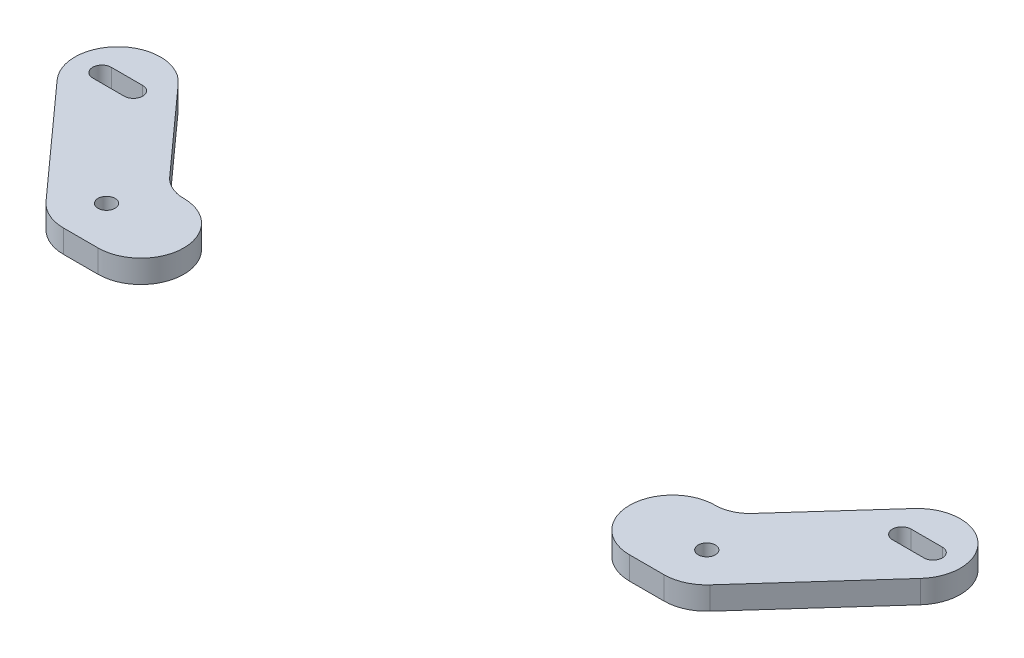
ISO-10303-21;
HEADER;
FILE_DESCRIPTION(('STEP AP214'),'2;1');
FILE_NAME('part.step','',(''),(''),'','','');
FILE_SCHEMA(('AUTOMOTIVE_DESIGN { 1 0 10303 214 1 1 1 1 }'));
ENDSEC;
DATA;
#1=APPLICATION_CONTEXT('core data for automotive mechanical design processes');
#2=APPLICATION_PROTOCOL_DEFINITION('international standard','automotive_design',2000,#1);
#3=PRODUCT_CONTEXT('',#1,'mechanical');
#4=PRODUCT('Part','Part','',(#3));
#5=PRODUCT_RELATED_PRODUCT_CATEGORY('part','',(#4));
#6=PRODUCT_DEFINITION_FORMATION('','',#4);
#7=PRODUCT_DEFINITION_CONTEXT('part definition',#1,'design');
#8=PRODUCT_DEFINITION('design','',#6,#7);
#9=PRODUCT_DEFINITION_SHAPE('','',#8);
#10=(LENGTH_UNIT() NAMED_UNIT(*) SI_UNIT(.MILLI.,.METRE.));
#11=(NAMED_UNIT(*) PLANE_ANGLE_UNIT() SI_UNIT($,.RADIAN.));
#12=(NAMED_UNIT(*) SI_UNIT($,.STERADIAN.) SOLID_ANGLE_UNIT());
#13=UNCERTAINTY_MEASURE_WITH_UNIT(LENGTH_MEASURE(1.E-05),#10,'distance_accuracy_value','');
#14=(GEOMETRIC_REPRESENTATION_CONTEXT(3) GLOBAL_UNCERTAINTY_ASSIGNED_CONTEXT((#13)) GLOBAL_UNIT_ASSIGNED_CONTEXT((#10,
#11,#12)) REPRESENTATION_CONTEXT('',''));
#15=CARTESIAN_POINT('',(0.,0.,0.));
#16=DIRECTION('',(0.,0.,1.));
#17=DIRECTION('',(1.,0.,0.));
#18=AXIS2_PLACEMENT_3D('',#15,#16,#17);
#19=CARTESIAN_POINT('',(92.970606407611,8.,-128.6));
#20=DIRECTION('',(0.,1.,0.));
#21=DIRECTION('',(0.,0.,1.));
#22=AXIS2_PLACEMENT_3D('',#19,#20,#21);
#23=PLANE('',#22);
#24=CARTESIAN_POINT('',(-92.970606407611,8.,-101.6));
#25=DIRECTION('',(0.,-1.,0.));
#26=DIRECTION('',(0.,0.,1.));
#27=AXIS2_PLACEMENT_3D('',#24,#25,#26);
#28=CIRCLE('',#27,15.);
#29=CARTESIAN_POINT('',(-92.970606407611,8.,-116.6));
#30=VERTEX_POINT('',#29);
#31=CARTESIAN_POINT('',(-92.970606407611,8.,-86.6000000000001));
#32=VERTEX_POINT('',#31);
#33=EDGE_CURVE('E12',#30,#32,#28,.T.);
#34=ORIENTED_EDGE('',*,*,#33,.F.);
#35=CARTESIAN_POINT('',(-92.970606407611,8.,-128.6));
#36=DIRECTION('',(0.,-1.,0.));
#37=DIRECTION('',(0.,0.,-1.));
#38=AXIS2_PLACEMENT_3D('',#35,#36,#37);
#39=CIRCLE('',#38,12.);
#40=CARTESIAN_POINT('',(-101.892422533762,8.,-120.574964360756));
#41=VERTEX_POINT('',#40);
#42=EDGE_CURVE('E174',#30,#41,#39,.T.);
#43=ORIENTED_EDGE('',*,*,#42,.T.);
#44=DIRECTION('',(-0.66875296993704,0.,-0.743484677179287));
#45=VECTOR('',#44,1.);
#46=CARTESIAN_POINT('',(-128.747729842311,8.,-150.431294549056));
#47=LINE('',#46,#45);
#48=CARTESIAN_POINT('',(-128.747729842311,8.,-150.431294549056));
#49=VERTEX_POINT('',#48);
#50=EDGE_CURVE('E172',#41,#49,#47,.T.);
#51=ORIENTED_EDGE('',*,*,#50,.T.);
#52=CARTESIAN_POINT('',(-139.9,8.,-140.4));
#53=DIRECTION('',(0.,1.,0.));
#54=DIRECTION('',(0.,0.,1.));
#55=AXIS2_PLACEMENT_3D('',#52,#53,#54);
#56=CIRCLE('',#55,15.);
#57=CARTESIAN_POINT('',(-151.052270157689,8.,-130.368705450944));
#58=VERTEX_POINT('',#57);
#59=EDGE_CURVE('E170',#49,#58,#56,.T.);
#60=ORIENTED_EDGE('',*,*,#59,.T.);
#61=DIRECTION('',(0.668752969937039,0.,0.743484677179287));
#62=VECTOR('',#61,1.);
#63=CARTESIAN_POINT('',(-151.052270157689,8.,-130.368705450944));
#64=LINE('',#63,#62);
#65=CARTESIAN_POINT('',(-116.152270157689,8.,-91.5687054509445));
#66=VERTEX_POINT('',#65);
#67=EDGE_CURVE('E168',#58,#66,#64,.T.);
#68=ORIENTED_EDGE('',*,*,#67,.T.);
#69=CARTESIAN_POINT('',(-105.,8.,-101.6));
#70=DIRECTION('',(0.,1.,0.));
#71=DIRECTION('',(0.,0.,1.));
#72=AXIS2_PLACEMENT_3D('',#69,#70,#71);
#73=CIRCLE('',#72,15.);
#74=CARTESIAN_POINT('',(-105.,8.,-86.6000000000001));
#75=VERTEX_POINT('',#74);
#76=EDGE_CURVE('E165',#66,#75,#73,.T.);
#77=ORIENTED_EDGE('',*,*,#76,.T.);
#78=DIRECTION('',(1.,0.,0.));
#79=VECTOR('',#78,1.);
#80=CARTESIAN_POINT('',(105.,8.,-86.6000000000001));
#81=LINE('',#80,#79);
#82=EDGE_CURVE('E167',#75,#32,#81,.T.);
#83=ORIENTED_EDGE('',*,*,#82,.T.);
#84=EDGE_LOOP('',(#34,#43,#51,#60,#68,#77,#83));
#85=FACE_BOUND('',#84,.T.);
#86=DIRECTION('',(1.,0.,0.));
#87=VECTOR('',#86,1.);
#88=CARTESIAN_POINT('',(-145.4,8.,-137.15));
#89=LINE('',#88,#87);
#90=CARTESIAN_POINT('',(-145.4,8.,-137.15));
#91=VERTEX_POINT('',#90);
#92=CARTESIAN_POINT('',(-134.4,8.,-137.15));
#93=VERTEX_POINT('',#92);
#94=EDGE_CURVE('E179',#91,#93,#89,.T.);
#95=ORIENTED_EDGE('',*,*,#94,.F.);
#96=CARTESIAN_POINT('',(-145.4,8.,-140.4));
#97=DIRECTION('',(0.,1.,0.));
#98=DIRECTION('',(0.,0.,1.));
#99=AXIS2_PLACEMENT_3D('',#96,#97,#98);
#100=CIRCLE('',#99,3.25);
#101=CARTESIAN_POINT('',(-145.4,8.,-143.65));
#102=VERTEX_POINT('',#101);
#103=EDGE_CURVE('E180',#102,#91,#100,.T.);
#104=ORIENTED_EDGE('',*,*,#103,.F.);
#105=DIRECTION('',(-1.,0.,0.));
#106=VECTOR('',#105,1.);
#107=CARTESIAN_POINT('',(-145.4,8.,-143.65));
#108=LINE('',#107,#106);
#109=CARTESIAN_POINT('',(-134.4,8.,-143.65));
#110=VERTEX_POINT('',#109);
#111=EDGE_CURVE('E186',#110,#102,#108,.T.);
#112=ORIENTED_EDGE('',*,*,#111,.F.);
#113=CARTESIAN_POINT('',(-134.4,8.,-140.4));
#114=DIRECTION('',(0.,1.,0.));
#115=DIRECTION('',(0.,0.,1.));
#116=AXIS2_PLACEMENT_3D('',#113,#114,#115);
#117=CIRCLE('',#116,3.25);
#118=EDGE_CURVE('E183',#93,#110,#117,.T.);
#119=ORIENTED_EDGE('',*,*,#118,.F.);
#120=EDGE_LOOP('',(#95,#104,#112,#119));
#121=FACE_BOUND('',#120,.T.);
#122=CARTESIAN_POINT('',(-105.,8.,-101.6));
#123=DIRECTION('',(0.,1.,0.));
#124=DIRECTION('',(0.,0.,1.));
#125=AXIS2_PLACEMENT_3D('',#122,#123,#124);
#126=CIRCLE('',#125,2.99999999999999);
#127=CARTESIAN_POINT('',(-105.,8.,-98.6000000000001));
#128=VERTEX_POINT('',#127);
#129=EDGE_CURVE('E58',#128,#128,#126,.T.);
#130=ORIENTED_EDGE('',*,*,#129,.F.);
#131=EDGE_LOOP('',(#130));
#132=FACE_BOUND('',#131,.T.);
#133=ADVANCED_FACE('F49',(#85,#121,#132),#23,.T.);
#134=CARTESIAN_POINT('',(92.970606407611,0.,-128.6));
#135=DIRECTION('',(0.,1.,0.));
#136=DIRECTION('',(0.,0.,1.));
#137=AXIS2_PLACEMENT_3D('',#134,#135,#136);
#138=PLANE('',#137);
#139=CARTESIAN_POINT('',(-105.,0.,-101.6));
#140=DIRECTION('',(0.,1.,0.));
#141=DIRECTION('',(0.,0.,1.));
#142=AXIS2_PLACEMENT_3D('',#139,#140,#141);
#143=CIRCLE('',#142,2.99999999999999);
#144=CARTESIAN_POINT('',(-105.,0.,-98.6000000000001));
#145=VERTEX_POINT('',#144);
#146=EDGE_CURVE('E201',#145,#145,#143,.T.);
#147=ORIENTED_EDGE('',*,*,#146,.T.);
#148=EDGE_LOOP('',(#147));
#149=FACE_BOUND('',#148,.T.);
#150=CARTESIAN_POINT('',(-145.4,0.,-140.4));
#151=DIRECTION('',(0.,1.,0.));
#152=DIRECTION('',(0.,0.,1.));
#153=AXIS2_PLACEMENT_3D('',#150,#151,#152);
#154=CIRCLE('',#153,3.25);
#155=CARTESIAN_POINT('',(-145.4,0.,-143.65));
#156=VERTEX_POINT('',#155);
#157=CARTESIAN_POINT('',(-145.4,0.,-137.15));
#158=VERTEX_POINT('',#157);
#159=EDGE_CURVE('E198',#156,#158,#154,.T.);
#160=ORIENTED_EDGE('',*,*,#159,.T.);
#161=DIRECTION('',(1.,0.,0.));
#162=VECTOR('',#161,1.);
#163=CARTESIAN_POINT('',(-145.4,0.,-137.15));
#164=LINE('',#163,#162);
#165=CARTESIAN_POINT('',(-134.4,0.,-137.15));
#166=VERTEX_POINT('',#165);
#167=EDGE_CURVE('E195',#158,#166,#164,.T.);
#168=ORIENTED_EDGE('',*,*,#167,.T.);
#169=CARTESIAN_POINT('',(-134.4,0.,-140.4));
#170=DIRECTION('',(0.,1.,0.));
#171=DIRECTION('',(0.,0.,1.));
#172=AXIS2_PLACEMENT_3D('',#169,#170,#171);
#173=CIRCLE('',#172,3.25);
#174=CARTESIAN_POINT('',(-134.4,0.,-143.65));
#175=VERTEX_POINT('',#174);
#176=EDGE_CURVE('E192',#166,#175,#173,.T.);
#177=ORIENTED_EDGE('',*,*,#176,.T.);
#178=DIRECTION('',(-1.,0.,0.));
#179=VECTOR('',#178,1.);
#180=CARTESIAN_POINT('',(-145.4,0.,-143.65));
#181=LINE('',#180,#179);
#182=EDGE_CURVE('E143',#175,#156,#181,.T.);
#183=ORIENTED_EDGE('',*,*,#182,.T.);
#184=EDGE_LOOP('',(#160,#168,#177,#183));
#185=FACE_BOUND('',#184,.T.);
#186=CARTESIAN_POINT('',(-92.970606407611,0.,-128.6));
#187=DIRECTION('',(0.,-1.,0.));
#188=DIRECTION('',(0.,0.,-1.));
#189=AXIS2_PLACEMENT_3D('',#186,#187,#188);
#190=CIRCLE('',#189,12.);
#191=CARTESIAN_POINT('',(-92.970606407611,0.,-116.6));
#192=VERTEX_POINT('',#191);
#193=CARTESIAN_POINT('',(-101.892422533762,0.,-120.574964360756));
#194=VERTEX_POINT('',#193);
#195=EDGE_CURVE('E142',#192,#194,#190,.T.);
#196=ORIENTED_EDGE('',*,*,#195,.F.);
#197=CARTESIAN_POINT('',(-92.970606407611,0.,-101.6));
#198=DIRECTION('',(0.,-1.,0.));
#199=DIRECTION('',(0.,0.,1.));
#200=AXIS2_PLACEMENT_3D('',#197,#198,#199);
#201=CIRCLE('',#200,15.);
#202=CARTESIAN_POINT('',(-92.970606407611,0.,-86.6000000000001));
#203=VERTEX_POINT('',#202);
#204=EDGE_CURVE('E129',#192,#203,#201,.T.);
#205=ORIENTED_EDGE('',*,*,#204,.T.);
#206=DIRECTION('',(1.,0.,0.));
#207=VECTOR('',#206,1.);
#208=CARTESIAN_POINT('',(105.,0.,-86.6000000000001));
#209=LINE('',#208,#207);
#210=CARTESIAN_POINT('',(-105.,0.,-86.6000000000001));
#211=VERTEX_POINT('',#210);
#212=EDGE_CURVE('E52',#211,#203,#209,.T.);
#213=ORIENTED_EDGE('',*,*,#212,.F.);
#214=CARTESIAN_POINT('',(-105.,0.,-101.6));
#215=DIRECTION('',(0.,1.,0.));
#216=DIRECTION('',(0.,0.,1.));
#217=AXIS2_PLACEMENT_3D('',#214,#215,#216);
#218=CIRCLE('',#217,15.);
#219=CARTESIAN_POINT('',(-116.152270157689,0.,-91.5687054509445));
#220=VERTEX_POINT('',#219);
#221=EDGE_CURVE('E154',#220,#211,#218,.T.);
#222=ORIENTED_EDGE('',*,*,#221,.F.);
#223=DIRECTION('',(0.668752969937039,0.,0.743484677179287));
#224=VECTOR('',#223,1.);
#225=CARTESIAN_POINT('',(-151.052270157689,0.,-130.368705450944));
#226=LINE('',#225,#224);
#227=CARTESIAN_POINT('',(-151.052270157689,0.,-130.368705450944));
#228=VERTEX_POINT('',#227);
#229=EDGE_CURVE('E157',#228,#220,#226,.T.);
#230=ORIENTED_EDGE('',*,*,#229,.F.);
#231=CARTESIAN_POINT('',(-139.9,0.,-140.4));
#232=DIRECTION('',(0.,1.,0.));
#233=DIRECTION('',(0.,0.,1.));
#234=AXIS2_PLACEMENT_3D('',#231,#232,#233);
#235=CIRCLE('',#234,15.);
#236=CARTESIAN_POINT('',(-128.747729842311,0.,-150.431294549056));
#237=VERTEX_POINT('',#236);
#238=EDGE_CURVE('E160',#237,#228,#235,.T.);
#239=ORIENTED_EDGE('',*,*,#238,.F.);
#240=DIRECTION('',(-0.66875296993704,0.,-0.743484677179287));
#241=VECTOR('',#240,1.);
#242=CARTESIAN_POINT('',(-128.747729842311,0.,-150.431294549056));
#243=LINE('',#242,#241);
#244=EDGE_CURVE('E163',#194,#237,#243,.T.);
#245=ORIENTED_EDGE('',*,*,#244,.F.);
#246=EDGE_LOOP('',(#196,#205,#213,#222,#230,#239,#245));
#247=FACE_BOUND('',#246,.T.);
#248=ADVANCED_FACE('F139',(#149,#185,#247),#138,.F.);
#249=CARTESIAN_POINT('',(105.,8.,-86.6000000000001));
#250=DIRECTION('',(0.,0.,-1.));
#251=DIRECTION('',(-1.,0.,0.));
#252=AXIS2_PLACEMENT_3D('',#249,#250,#251);
#253=PLANE('',#252);
#254=DIRECTION('',(0.,1.,0.));
#255=VECTOR('',#254,1.);
#256=CARTESIAN_POINT('',(-92.970606407611,0.,-86.6000000000001));
#257=LINE('',#256,#255);
#258=EDGE_CURVE('E126',#203,#32,#257,.T.);
#259=ORIENTED_EDGE('',*,*,#258,.T.);
#260=ORIENTED_EDGE('',*,*,#82,.F.);
#261=DIRECTION('',(0.,-1.,0.));
#262=VECTOR('',#261,1.);
#263=CARTESIAN_POINT('',(-105.,8.,-86.6000000000001));
#264=LINE('',#263,#262);
#265=EDGE_CURVE('E134',#75,#211,#264,.T.);
#266=ORIENTED_EDGE('',*,*,#265,.T.);
#267=ORIENTED_EDGE('',*,*,#212,.T.);
#268=EDGE_LOOP('',(#259,#260,#266,#267));
#269=FACE_BOUND('',#268,.T.);
#270=ADVANCED_FACE('F146',(#269),#253,.F.);
#271=CARTESIAN_POINT('',(-92.970606407611,8.,-128.6));
#272=DIRECTION('',(0.,-1.,0.));
#273=DIRECTION('',(0.,0.,-1.));
#274=AXIS2_PLACEMENT_3D('',#271,#272,#273);
#275=CYLINDRICAL_SURFACE('',#274,12.);
#276=ORIENTED_EDGE('',*,*,#195,.T.);
#277=DIRECTION('',(0.,-1.,0.));
#278=VECTOR('',#277,1.);
#279=CARTESIAN_POINT('',(-101.892422533762,8.,-120.574964360756));
#280=LINE('',#279,#278);
#281=EDGE_CURVE('E162',#41,#194,#280,.T.);
#282=ORIENTED_EDGE('',*,*,#281,.F.);
#283=ORIENTED_EDGE('',*,*,#42,.F.);
#284=DIRECTION('',(0.,-1.,0.));
#285=VECTOR('',#284,1.);
#286=CARTESIAN_POINT('',(-92.970606407611,8.,-116.6));
#287=LINE('',#286,#285);
#288=EDGE_CURVE('E66',#30,#192,#287,.T.);
#289=ORIENTED_EDGE('',*,*,#288,.T.);
#290=EDGE_LOOP('',(#276,#282,#283,#289));
#291=FACE_BOUND('',#290,.T.);
#292=ADVANCED_FACE('F233',(#291),#275,.F.);
#293=CARTESIAN_POINT('',(-128.747729842311,8.,-150.431294549056));
#294=DIRECTION('',(-0.743484677179287,0.,0.66875296993704));
#295=DIRECTION('',(0.66875296993704,0.,0.743484677179287));
#296=AXIS2_PLACEMENT_3D('',#293,#294,#295);
#297=PLANE('',#296);
#298=ORIENTED_EDGE('',*,*,#244,.T.);
#299=DIRECTION('',(0.,-1.,0.));
#300=VECTOR('',#299,1.);
#301=CARTESIAN_POINT('',(-128.747729842311,8.,-150.431294549056));
#302=LINE('',#301,#300);
#303=EDGE_CURVE('E159',#49,#237,#302,.T.);
#304=ORIENTED_EDGE('',*,*,#303,.F.);
#305=ORIENTED_EDGE('',*,*,#50,.F.);
#306=ORIENTED_EDGE('',*,*,#281,.T.);
#307=EDGE_LOOP('',(#298,#304,#305,#306));
#308=FACE_BOUND('',#307,.T.);
#309=ADVANCED_FACE('F238',(#308),#297,.F.);
#310=CARTESIAN_POINT('',(-139.9,8.,-140.4));
#311=DIRECTION('',(0.,-1.,0.));
#312=DIRECTION('',(0.,0.,-1.));
#313=AXIS2_PLACEMENT_3D('',#310,#311,#312);
#314=CYLINDRICAL_SURFACE('',#313,15.);
#315=ORIENTED_EDGE('',*,*,#238,.T.);
#316=DIRECTION('',(0.,-1.,0.));
#317=VECTOR('',#316,1.);
#318=CARTESIAN_POINT('',(-151.052270157689,8.,-130.368705450944));
#319=LINE('',#318,#317);
#320=EDGE_CURVE('E156',#58,#228,#319,.T.);
#321=ORIENTED_EDGE('',*,*,#320,.F.);
#322=ORIENTED_EDGE('',*,*,#59,.F.);
#323=ORIENTED_EDGE('',*,*,#303,.T.);
#324=EDGE_LOOP('',(#315,#321,#322,#323));
#325=FACE_BOUND('',#324,.T.);
#326=ADVANCED_FACE('F239',(#325),#314,.T.);
#327=CARTESIAN_POINT('',(-151.052270157689,8.,-130.368705450944));
#328=DIRECTION('',(0.743484677179287,0.,-0.668752969937039));
#329=DIRECTION('',(-0.668752969937039,0.,-0.743484677179287));
#330=AXIS2_PLACEMENT_3D('',#327,#328,#329);
#331=PLANE('',#330);
#332=ORIENTED_EDGE('',*,*,#229,.T.);
#333=DIRECTION('',(0.,-1.,0.));
#334=VECTOR('',#333,1.);
#335=CARTESIAN_POINT('',(-116.152270157689,8.,-91.5687054509445));
#336=LINE('',#335,#334);
#337=EDGE_CURVE('E152',#66,#220,#336,.T.);
#338=ORIENTED_EDGE('',*,*,#337,.F.);
#339=ORIENTED_EDGE('',*,*,#67,.F.);
#340=ORIENTED_EDGE('',*,*,#320,.T.);
#341=EDGE_LOOP('',(#332,#338,#339,#340));
#342=FACE_BOUND('',#341,.T.);
#343=ADVANCED_FACE('F223',(#342),#331,.F.);
#344=CARTESIAN_POINT('',(-105.,8.,-101.6));
#345=DIRECTION('',(0.,-1.,0.));
#346=DIRECTION('',(0.,0.,-1.));
#347=AXIS2_PLACEMENT_3D('',#344,#345,#346);
#348=CYLINDRICAL_SURFACE('',#347,15.);
#349=ORIENTED_EDGE('',*,*,#221,.T.);
#350=ORIENTED_EDGE('',*,*,#265,.F.);
#351=ORIENTED_EDGE('',*,*,#76,.F.);
#352=ORIENTED_EDGE('',*,*,#337,.T.);
#353=EDGE_LOOP('',(#349,#350,#351,#352));
#354=FACE_BOUND('',#353,.T.);
#355=ADVANCED_FACE('F218',(#354),#348,.T.);
#356=CARTESIAN_POINT('',(-145.4,8.,-140.4));
#357=DIRECTION('',(0.,-1.,0.));
#358=DIRECTION('',(0.,0.,-1.));
#359=AXIS2_PLACEMENT_3D('',#356,#357,#358);
#360=CYLINDRICAL_SURFACE('',#359,3.25);
#361=ORIENTED_EDGE('',*,*,#159,.F.);
#362=DIRECTION('',(0.,-1.,0.));
#363=VECTOR('',#362,1.);
#364=CARTESIAN_POINT('',(-145.4,8.,-143.65));
#365=LINE('',#364,#363);
#366=EDGE_CURVE('E187',#102,#156,#365,.T.);
#367=ORIENTED_EDGE('',*,*,#366,.F.);
#368=ORIENTED_EDGE('',*,*,#103,.T.);
#369=DIRECTION('',(0.,-1.,0.));
#370=VECTOR('',#369,1.);
#371=CARTESIAN_POINT('',(-145.4,8.,-137.15));
#372=LINE('',#371,#370);
#373=EDGE_CURVE('E176',#91,#158,#372,.T.);
#374=ORIENTED_EDGE('',*,*,#373,.T.);
#375=EDGE_LOOP('',(#361,#367,#368,#374));
#376=FACE_BOUND('',#375,.T.);
#377=ADVANCED_FACE('F276',(#376),#360,.F.);
#378=CARTESIAN_POINT('',(-145.4,8.,-137.15));
#379=DIRECTION('',(0.,0.,-1.));
#380=DIRECTION('',(-1.,0.,0.));
#381=AXIS2_PLACEMENT_3D('',#378,#379,#380);
#382=PLANE('',#381);
#383=ORIENTED_EDGE('',*,*,#167,.F.);
#384=ORIENTED_EDGE('',*,*,#373,.F.);
#385=ORIENTED_EDGE('',*,*,#94,.T.);
#386=DIRECTION('',(0.,-1.,0.));
#387=VECTOR('',#386,1.);
#388=CARTESIAN_POINT('',(-134.4,8.,-137.15));
#389=LINE('',#388,#387);
#390=EDGE_CURVE('E181',#93,#166,#389,.T.);
#391=ORIENTED_EDGE('',*,*,#390,.T.);
#392=EDGE_LOOP('',(#383,#384,#385,#391));
#393=FACE_BOUND('',#392,.T.);
#394=ADVANCED_FACE('F272',(#393),#382,.T.);
#395=CARTESIAN_POINT('',(-134.4,8.,-140.4));
#396=DIRECTION('',(0.,-1.,0.));
#397=DIRECTION('',(0.,0.,-1.));
#398=AXIS2_PLACEMENT_3D('',#395,#396,#397);
#399=CYLINDRICAL_SURFACE('',#398,3.25);
#400=ORIENTED_EDGE('',*,*,#176,.F.);
#401=ORIENTED_EDGE('',*,*,#390,.F.);
#402=ORIENTED_EDGE('',*,*,#118,.T.);
#403=DIRECTION('',(0.,-1.,0.));
#404=VECTOR('',#403,1.);
#405=CARTESIAN_POINT('',(-134.4,8.,-143.65));
#406=LINE('',#405,#404);
#407=EDGE_CURVE('E184',#110,#175,#406,.T.);
#408=ORIENTED_EDGE('',*,*,#407,.T.);
#409=EDGE_LOOP('',(#400,#401,#402,#408));
#410=FACE_BOUND('',#409,.T.);
#411=ADVANCED_FACE('F268',(#410),#399,.F.);
#412=CARTESIAN_POINT('',(-145.4,8.,-143.65));
#413=DIRECTION('',(0.,0.,1.));
#414=DIRECTION('',(1.,0.,0.));
#415=AXIS2_PLACEMENT_3D('',#412,#413,#414);
#416=PLANE('',#415);
#417=ORIENTED_EDGE('',*,*,#182,.F.);
#418=ORIENTED_EDGE('',*,*,#407,.F.);
#419=ORIENTED_EDGE('',*,*,#111,.T.);
#420=ORIENTED_EDGE('',*,*,#366,.T.);
#421=EDGE_LOOP('',(#417,#418,#419,#420));
#422=FACE_BOUND('',#421,.T.);
#423=ADVANCED_FACE('F264',(#422),#416,.T.);
#424=CARTESIAN_POINT('',(-105.,8.,-101.6));
#425=DIRECTION('',(0.,-1.,0.));
#426=DIRECTION('',(0.,0.,-1.));
#427=AXIS2_PLACEMENT_3D('',#424,#425,#426);
#428=CYLINDRICAL_SURFACE('',#427,2.99999999999999);
#429=ORIENTED_EDGE('',*,*,#129,.T.);
#430=EDGE_LOOP('',(#429));
#431=FACE_BOUND('',#430,.T.);
#432=ORIENTED_EDGE('',*,*,#146,.F.);
#433=EDGE_LOOP('',(#432));
#434=FACE_BOUND('',#433,.T.);
#435=ADVANCED_FACE('F261',(#431,#434),#428,.F.);
#436=CARTESIAN_POINT('',(-92.970606407611,0.,-101.6));
#437=DIRECTION('',(0.,1.,0.));
#438=DIRECTION('',(0.,0.,1.));
#439=AXIS2_PLACEMENT_3D('',#436,#437,#438);
#440=CYLINDRICAL_SURFACE('',#439,15.);
#441=ORIENTED_EDGE('',*,*,#33,.T.);
#442=ORIENTED_EDGE('',*,*,#258,.F.);
#443=ORIENTED_EDGE('',*,*,#204,.F.);
#444=ORIENTED_EDGE('',*,*,#288,.F.);
#445=EDGE_LOOP('',(#441,#442,#443,#444));
#446=FACE_BOUND('',#445,.T.);
#447=ADVANCED_FACE('F128',(#446),#440,.T.);
#448=CLOSED_SHELL('',(#133,#248,#270,#292,#309,#326,#343,#355,#377,#394,#411,#423,#435,#447));
#449=MANIFOLD_SOLID_BREP('B2',#448);
#450=CARTESIAN_POINT('',(105.,8.,-101.6));
#451=DIRECTION('',(0.,-1.,0.));
#452=DIRECTION('',(0.,0.,-1.));
#453=AXIS2_PLACEMENT_3D('',#450,#451,#452);
#454=CYLINDRICAL_SURFACE('',#453,2.99999999999996);
#455=CARTESIAN_POINT('',(105.,8.,-101.6));
#456=DIRECTION('',(0.,1.,0.));
#457=DIRECTION('',(0.,0.,1.));
#458=AXIS2_PLACEMENT_3D('',#455,#456,#457);
#459=CIRCLE('',#458,2.99999999999996);
#460=CARTESIAN_POINT('',(105.,8.,-98.6000000000001));
#461=VERTEX_POINT('',#460);
#462=EDGE_CURVE('E527',#461,#461,#459,.T.);
#463=ORIENTED_EDGE('',*,*,#462,.T.);
#464=EDGE_LOOP('',(#463));
#465=FACE_BOUND('',#464,.T.);
#466=CARTESIAN_POINT('',(105.,0.,-101.6));
#467=DIRECTION('',(0.,1.,0.));
#468=DIRECTION('',(0.,0.,1.));
#469=AXIS2_PLACEMENT_3D('',#466,#467,#468);
#470=CIRCLE('',#469,2.99999999999996);
#471=CARTESIAN_POINT('',(105.,0.,-98.6000000000001));
#472=VERTEX_POINT('',#471);
#473=EDGE_CURVE('E534',#472,#472,#470,.T.);
#474=ORIENTED_EDGE('',*,*,#473,.F.);
#475=EDGE_LOOP('',(#474));
#476=FACE_BOUND('',#475,.T.);
#477=ADVANCED_FACE('F350',(#465,#476),#454,.F.);
#478=CARTESIAN_POINT('',(145.4,8.,-137.15));
#479=DIRECTION('',(0.,0.,-1.));
#480=DIRECTION('',(-1.,0.,0.));
#481=AXIS2_PLACEMENT_3D('',#478,#479,#480);
#482=PLANE('',#481);
#483=DIRECTION('',(1.,0.,0.));
#484=VECTOR('',#483,1.);
#485=CARTESIAN_POINT('',(145.4,0.,-137.15));
#486=LINE('',#485,#484);
#487=CARTESIAN_POINT('',(134.4,0.,-137.15));
#488=VERTEX_POINT('',#487);
#489=CARTESIAN_POINT('',(145.4,0.,-137.15));
#490=VERTEX_POINT('',#489);
#491=EDGE_CURVE('E514',#488,#490,#486,.T.);
#492=ORIENTED_EDGE('',*,*,#491,.F.);
#493=DIRECTION('',(0.,-1.,0.));
#494=VECTOR('',#493,1.);
#495=CARTESIAN_POINT('',(134.4,8.,-137.15));
#496=LINE('',#495,#494);
#497=CARTESIAN_POINT('',(134.4,8.,-137.15));
#498=VERTEX_POINT('',#497);
#499=EDGE_CURVE('E372',#498,#488,#496,.T.);
#500=ORIENTED_EDGE('',*,*,#499,.F.);
#501=DIRECTION('',(1.,0.,0.));
#502=VECTOR('',#501,1.);
#503=CARTESIAN_POINT('',(145.4,8.,-137.15));
#504=LINE('',#503,#502);
#505=CARTESIAN_POINT('',(145.4,8.,-137.15));
#506=VERTEX_POINT('',#505);
#507=EDGE_CURVE('E513',#498,#506,#504,.T.);
#508=ORIENTED_EDGE('',*,*,#507,.T.);
#509=DIRECTION('',(0.,-1.,0.));
#510=VECTOR('',#509,1.);
#511=CARTESIAN_POINT('',(145.4,8.,-137.15));
#512=LINE('',#511,#510);
#513=EDGE_CURVE('E510',#506,#490,#512,.T.);
#514=ORIENTED_EDGE('',*,*,#513,.T.);
#515=EDGE_LOOP('',(#492,#500,#508,#514));
#516=FACE_BOUND('',#515,.T.);
#517=ADVANCED_FACE('F551',(#516),#482,.T.);
#518=CARTESIAN_POINT('',(134.4,8.,-140.4));
#519=DIRECTION('',(0.,-1.,0.));
#520=DIRECTION('',(0.,0.,-1.));
#521=AXIS2_PLACEMENT_3D('',#518,#519,#520);
#522=CYLINDRICAL_SURFACE('',#521,3.25);
#523=CARTESIAN_POINT('',(134.4,0.,-140.4));
#524=DIRECTION('',(0.,1.,0.));
#525=DIRECTION('',(0.,0.,1.));
#526=AXIS2_PLACEMENT_3D('',#523,#524,#525);
#527=CIRCLE('',#526,3.25);
#528=CARTESIAN_POINT('',(134.4,0.,-143.65));
#529=VERTEX_POINT('',#528);
#530=EDGE_CURVE('E518',#529,#488,#527,.T.);
#531=ORIENTED_EDGE('',*,*,#530,.F.);
#532=DIRECTION('',(0.,-1.,0.));
#533=VECTOR('',#532,1.);
#534=CARTESIAN_POINT('',(134.4,8.,-143.65));
#535=LINE('',#534,#533);
#536=CARTESIAN_POINT('',(134.4,8.,-143.65));
#537=VERTEX_POINT('',#536);
#538=EDGE_CURVE('E456',#537,#529,#535,.T.);
#539=ORIENTED_EDGE('',*,*,#538,.F.);
#540=CARTESIAN_POINT('',(134.4,8.,-140.4));
#541=DIRECTION('',(0.,1.,0.));
#542=DIRECTION('',(0.,0.,1.));
#543=AXIS2_PLACEMENT_3D('',#540,#541,#542);
#544=CIRCLE('',#543,3.25);
#545=EDGE_CURVE('E529',#537,#498,#544,.T.);
#546=ORIENTED_EDGE('',*,*,#545,.T.);
#547=ORIENTED_EDGE('',*,*,#499,.T.);
#548=EDGE_LOOP('',(#531,#539,#546,#547));
#549=FACE_BOUND('',#548,.T.);
#550=ADVANCED_FACE('F557',(#549),#522,.F.);
#551=CARTESIAN_POINT('',(145.4,8.,-143.65));
#552=DIRECTION('',(0.,0.,1.));
#553=DIRECTION('',(1.,0.,0.));
#554=AXIS2_PLACEMENT_3D('',#551,#552,#553);
#555=PLANE('',#554);
#556=DIRECTION('',(-1.,0.,0.));
#557=VECTOR('',#556,1.);
#558=CARTESIAN_POINT('',(145.4,0.,-143.65));
#559=LINE('',#558,#557);
#560=CARTESIAN_POINT('',(145.4,0.,-143.65));
#561=VERTEX_POINT('',#560);
#562=EDGE_CURVE('E521',#561,#529,#559,.T.);
#563=ORIENTED_EDGE('',*,*,#562,.F.);
#564=DIRECTION('',(0.,-1.,0.));
#565=VECTOR('',#564,1.);
#566=CARTESIAN_POINT('',(145.4,8.,-143.65));
#567=LINE('',#566,#565);
#568=CARTESIAN_POINT('',(145.4,8.,-143.65));
#569=VERTEX_POINT('',#568);
#570=EDGE_CURVE('E451',#569,#561,#567,.T.);
#571=ORIENTED_EDGE('',*,*,#570,.F.);
#572=DIRECTION('',(-1.,0.,0.));
#573=VECTOR('',#572,1.);
#574=CARTESIAN_POINT('',(145.4,8.,-143.65));
#575=LINE('',#574,#573);
#576=EDGE_CURVE('E531',#569,#537,#575,.T.);
#577=ORIENTED_EDGE('',*,*,#576,.T.);
#578=ORIENTED_EDGE('',*,*,#538,.T.);
#579=EDGE_LOOP('',(#563,#571,#577,#578));
#580=FACE_BOUND('',#579,.T.);
#581=ADVANCED_FACE('F564',(#580),#555,.T.);
#582=CARTESIAN_POINT('',(145.4,8.,-140.4));
#583=DIRECTION('',(0.,-1.,0.));
#584=DIRECTION('',(0.,0.,-1.));
#585=AXIS2_PLACEMENT_3D('',#582,#583,#584);
#586=CYLINDRICAL_SURFACE('',#585,3.25);
#587=CARTESIAN_POINT('',(145.4,0.,-140.4));
#588=DIRECTION('',(0.,1.,0.));
#589=DIRECTION('',(0.,0.,1.));
#590=AXIS2_PLACEMENT_3D('',#587,#588,#589);
#591=CIRCLE('',#590,3.25);
#592=EDGE_CURVE('E524',#490,#561,#591,.T.);
#593=ORIENTED_EDGE('',*,*,#592,.F.);
#594=ORIENTED_EDGE('',*,*,#513,.F.);
#595=CARTESIAN_POINT('',(145.4,8.,-140.4));
#596=DIRECTION('',(0.,1.,0.));
#597=DIRECTION('',(0.,0.,1.));
#598=AXIS2_PLACEMENT_3D('',#595,#596,#597);
#599=CIRCLE('',#598,3.25);
#600=EDGE_CURVE('E517',#506,#569,#599,.T.);
#601=ORIENTED_EDGE('',*,*,#600,.T.);
#602=ORIENTED_EDGE('',*,*,#570,.T.);
#603=EDGE_LOOP('',(#593,#594,#601,#602));
#604=FACE_BOUND('',#603,.T.);
#605=ADVANCED_FACE('F568',(#604),#586,.F.);
#606=CARTESIAN_POINT('',(116.152270157689,8.,-91.5687054509444));
#607=DIRECTION('',(-0.743484677179287,0.,-0.66875296993704));
#608=DIRECTION('',(-0.66875296993704,0.,0.743484677179287));
#609=AXIS2_PLACEMENT_3D('',#606,#607,#608);
#610=PLANE('',#609);
#611=DIRECTION('',(0.66875296993704,0.,-0.743484677179287));
#612=VECTOR('',#611,1.);
#613=CARTESIAN_POINT('',(116.152270157689,0.,-91.5687054509444));
#614=LINE('',#613,#612);
#615=CARTESIAN_POINT('',(116.152270157689,0.,-91.5687054509444));
#616=VERTEX_POINT('',#615);
#617=CARTESIAN_POINT('',(151.052270157689,0.,-130.368705450944));
#618=VERTEX_POINT('',#617);
#619=EDGE_CURVE('E463',#616,#618,#614,.T.);
#620=ORIENTED_EDGE('',*,*,#619,.T.);
#621=DIRECTION('',(0.,-1.,0.));
#622=VECTOR('',#621,1.);
#623=CARTESIAN_POINT('',(151.052270157689,8.,-130.368705450944));
#624=LINE('',#623,#622);
#625=CARTESIAN_POINT('',(151.052270157689,8.,-130.368705450944));
#626=VERTEX_POINT('',#625);
#627=EDGE_CURVE('E474',#626,#618,#624,.T.);
#628=ORIENTED_EDGE('',*,*,#627,.F.);
#629=DIRECTION('',(0.66875296993704,0.,-0.743484677179287));
#630=VECTOR('',#629,1.);
#631=CARTESIAN_POINT('',(116.152270157689,8.,-91.5687054509444));
#632=LINE('',#631,#630);
#633=CARTESIAN_POINT('',(116.152270157689,8.,-91.5687054509444));
#634=VERTEX_POINT('',#633);
#635=EDGE_CURVE('E501',#634,#626,#632,.T.);
#636=ORIENTED_EDGE('',*,*,#635,.F.);
#637=DIRECTION('',(0.,-1.,0.));
#638=VECTOR('',#637,1.);
#639=CARTESIAN_POINT('',(116.152270157689,8.,-91.5687054509444));
#640=LINE('',#639,#638);
#641=EDGE_CURVE('E477',#634,#616,#640,.T.);
#642=ORIENTED_EDGE('',*,*,#641,.T.);
#643=EDGE_LOOP('',(#620,#628,#636,#642));
#644=FACE_BOUND('',#643,.T.);
#645=ADVANCED_FACE('F492',(#644),#610,.F.);
#646=CARTESIAN_POINT('',(139.9,8.,-140.4));
#647=DIRECTION('',(0.,-1.,0.));
#648=DIRECTION('',(0.,0.,-1.));
#649=AXIS2_PLACEMENT_3D('',#646,#647,#648);
#650=CYLINDRICAL_SURFACE('',#649,15.);
#651=CARTESIAN_POINT('',(139.9,0.,-140.4));
#652=DIRECTION('',(0.,1.,0.));
#653=DIRECTION('',(0.,0.,1.));
#654=AXIS2_PLACEMENT_3D('',#651,#652,#653);
#655=CIRCLE('',#654,15.);
#656=CARTESIAN_POINT('',(128.747729842311,0.,-150.431294549056));
#657=VERTEX_POINT('',#656);
#658=EDGE_CURVE('E465',#618,#657,#655,.T.);
#659=ORIENTED_EDGE('',*,*,#658,.T.);
#660=DIRECTION('',(0.,-1.,0.));
#661=VECTOR('',#660,1.);
#662=CARTESIAN_POINT('',(128.747729842311,8.,-150.431294549056));
#663=LINE('',#662,#661);
#664=CARTESIAN_POINT('',(128.747729842311,8.,-150.431294549056));
#665=VERTEX_POINT('',#664);
#666=EDGE_CURVE('E471',#665,#657,#663,.T.);
#667=ORIENTED_EDGE('',*,*,#666,.F.);
#668=CARTESIAN_POINT('',(139.9,8.,-140.4));
#669=DIRECTION('',(0.,1.,0.));
#670=DIRECTION('',(0.,0.,1.));
#671=AXIS2_PLACEMENT_3D('',#668,#669,#670);
#672=CIRCLE('',#671,15.);
#673=EDGE_CURVE('E498',#626,#665,#672,.T.);
#674=ORIENTED_EDGE('',*,*,#673,.F.);
#675=ORIENTED_EDGE('',*,*,#627,.T.);
#676=EDGE_LOOP('',(#659,#667,#674,#675));
#677=FACE_BOUND('',#676,.T.);
#678=ADVANCED_FACE('F496',(#677),#650,.T.);
#679=CARTESIAN_POINT('',(101.892422533762,8.,-120.574964360756));
#680=DIRECTION('',(0.743484677179287,0.,0.668752969937041));
#681=DIRECTION('',(0.668752969937041,0.,-0.743484677179287));
#682=AXIS2_PLACEMENT_3D('',#679,#680,#681);
#683=PLANE('',#682);
#684=DIRECTION('',(-0.66875296993704,0.,0.743484677179286));
#685=VECTOR('',#684,1.);
#686=CARTESIAN_POINT('',(101.892422533762,0.,-120.574964360756));
#687=LINE('',#686,#685);
#688=CARTESIAN_POINT('',(101.892422533762,0.,-120.574964360756));
#689=VERTEX_POINT('',#688);
#690=EDGE_CURVE('E467',#657,#689,#687,.T.);
#691=ORIENTED_EDGE('',*,*,#690,.T.);
#692=DIRECTION('',(0.,-1.,0.));
#693=VECTOR('',#692,1.);
#694=CARTESIAN_POINT('',(101.892422533762,8.,-120.574964360756));
#695=LINE('',#694,#693);
#696=CARTESIAN_POINT('',(101.892422533762,8.,-120.574964360756));
#697=VERTEX_POINT('',#696);
#698=EDGE_CURVE('E450',#697,#689,#695,.T.);
#699=ORIENTED_EDGE('',*,*,#698,.F.);
#700=DIRECTION('',(-0.66875296993704,0.,0.743484677179286));
#701=VECTOR('',#700,1.);
#702=CARTESIAN_POINT('',(101.892422533762,8.,-120.574964360756));
#703=LINE('',#702,#701);
#704=EDGE_CURVE('E459',#665,#697,#703,.T.);
#705=ORIENTED_EDGE('',*,*,#704,.F.);
#706=ORIENTED_EDGE('',*,*,#666,.T.);
#707=EDGE_LOOP('',(#691,#699,#705,#706));
#708=FACE_BOUND('',#707,.T.);
#709=ADVANCED_FACE('F575',(#708),#683,.F.);
#710=CARTESIAN_POINT('',(105.,8.,-101.6));
#711=DIRECTION('',(0.,-1.,0.));
#712=DIRECTION('',(0.,0.,-1.));
#713=AXIS2_PLACEMENT_3D('',#710,#711,#712);
#714=CYLINDRICAL_SURFACE('',#713,15.);
#715=CARTESIAN_POINT('',(105.,0.,-101.6));
#716=DIRECTION('',(0.,1.,0.));
#717=DIRECTION('',(0.,0.,1.));
#718=AXIS2_PLACEMENT_3D('',#715,#716,#717);
#719=CIRCLE('',#718,15.);
#720=CARTESIAN_POINT('',(105.,0.,-86.6000000000001));
#721=VERTEX_POINT('',#720);
#722=EDGE_CURVE('E453',#721,#616,#719,.T.);
#723=ORIENTED_EDGE('',*,*,#722,.T.);
#724=ORIENTED_EDGE('',*,*,#641,.F.);
#725=CARTESIAN_POINT('',(105.,8.,-101.6));
#726=DIRECTION('',(0.,1.,0.));
#727=DIRECTION('',(0.,0.,1.));
#728=AXIS2_PLACEMENT_3D('',#725,#726,#727);
#729=CIRCLE('',#728,15.);
#730=CARTESIAN_POINT('',(105.,8.,-86.6000000000001));
#731=VERTEX_POINT('',#730);
#732=EDGE_CURVE('E485',#731,#634,#729,.T.);
#733=ORIENTED_EDGE('',*,*,#732,.F.);
#734=DIRECTION('',(0.,-1.,0.));
#735=VECTOR('',#734,1.);
#736=CARTESIAN_POINT('',(105.,8.,-86.6000000000001));
#737=LINE('',#736,#735);
#738=EDGE_CURVE('E358',#731,#721,#737,.T.);
#739=ORIENTED_EDGE('',*,*,#738,.T.);
#740=EDGE_LOOP('',(#723,#724,#733,#739));
#741=FACE_BOUND('',#740,.T.);
#742=ADVANCED_FACE('F483',(#741),#714,.T.);
#743=CARTESIAN_POINT('',(92.970606407611,8.,-128.6));
#744=DIRECTION('',(0.,-1.,0.));
#745=DIRECTION('',(0.,0.,-1.));
#746=AXIS2_PLACEMENT_3D('',#743,#744,#745);
#747=CYLINDRICAL_SURFACE('',#746,12.);
#748=CARTESIAN_POINT('',(92.970606407611,0.,-128.6));
#749=DIRECTION('',(0.,-1.,0.));
#750=DIRECTION('',(0.,0.,1.));
#751=AXIS2_PLACEMENT_3D('',#748,#749,#750);
#752=CIRCLE('',#751,12.);
#753=CARTESIAN_POINT('',(92.970606407611,0.,-116.6));
#754=VERTEX_POINT('',#753);
#755=EDGE_CURVE('E443',#689,#754,#752,.T.);
#756=ORIENTED_EDGE('',*,*,#755,.T.);
#757=DIRECTION('',(0.,-1.,0.));
#758=VECTOR('',#757,1.);
#759=CARTESIAN_POINT('',(92.970606407611,8.,-116.6));
#760=LINE('',#759,#758);
#761=CARTESIAN_POINT('',(92.970606407611,8.,-116.6));
#762=VERTEX_POINT('',#761);
#763=EDGE_CURVE('E47',#762,#754,#760,.T.);
#764=ORIENTED_EDGE('',*,*,#763,.F.);
#765=CARTESIAN_POINT('',(92.970606407611,8.,-128.6));
#766=DIRECTION('',(0.,-1.,0.));
#767=DIRECTION('',(0.,0.,1.));
#768=AXIS2_PLACEMENT_3D('',#765,#766,#767);
#769=CIRCLE('',#768,12.);
#770=EDGE_CURVE('E469',#697,#762,#769,.T.);
#771=ORIENTED_EDGE('',*,*,#770,.F.);
#772=ORIENTED_EDGE('',*,*,#698,.T.);
#773=EDGE_LOOP('',(#756,#764,#771,#772));
#774=FACE_BOUND('',#773,.T.);
#775=ADVANCED_FACE('F352',(#774),#747,.F.);
#776=CARTESIAN_POINT('',(105.,8.,-86.6000000000001));
#777=DIRECTION('',(0.,0.,-1.));
#778=DIRECTION('',(-1.,0.,0.));
#779=AXIS2_PLACEMENT_3D('',#776,#777,#778);
#780=PLANE('',#779);
#781=DIRECTION('',(1.,0.,0.));
#782=VECTOR('',#781,1.);
#783=CARTESIAN_POINT('',(105.,8.,-86.6000000000001));
#784=LINE('',#783,#782);
#785=CARTESIAN_POINT('',(92.970606407611,8.,-86.6000000000001));
#786=VERTEX_POINT('',#785);
#787=EDGE_CURVE('E505',#786,#731,#784,.T.);
#788=ORIENTED_EDGE('',*,*,#787,.F.);
#789=DIRECTION('',(0.,1.,0.));
#790=VECTOR('',#789,1.);
#791=CARTESIAN_POINT('',(92.970606407611,0.,-86.6000000000001));
#792=LINE('',#791,#790);
#793=CARTESIAN_POINT('',(92.970606407611,0.,-86.6000000000001));
#794=VERTEX_POINT('',#793);
#795=EDGE_CURVE('E446',#794,#786,#792,.T.);
#796=ORIENTED_EDGE('',*,*,#795,.F.);
#797=DIRECTION('',(1.,0.,0.));
#798=VECTOR('',#797,1.);
#799=CARTESIAN_POINT('',(105.,0.,-86.6000000000001));
#800=LINE('',#799,#798);
#801=EDGE_CURVE('E445',#794,#721,#800,.T.);
#802=ORIENTED_EDGE('',*,*,#801,.T.);
#803=ORIENTED_EDGE('',*,*,#738,.F.);
#804=EDGE_LOOP('',(#788,#796,#802,#803));
#805=FACE_BOUND('',#804,.T.);
#806=ADVANCED_FACE('F542',(#805),#780,.F.);
#807=CARTESIAN_POINT('',(92.970606407611,0.,-128.6));
#808=DIRECTION('',(0.,1.,0.));
#809=DIRECTION('',(0.,0.,1.));
#810=AXIS2_PLACEMENT_3D('',#807,#808,#809);
#811=PLANE('',#810);
#812=ORIENTED_EDGE('',*,*,#801,.F.);
#813=CARTESIAN_POINT('',(92.970606407611,0.,-101.6));
#814=DIRECTION('',(0.,-1.,0.));
#815=DIRECTION('',(0.,0.,1.));
#816=AXIS2_PLACEMENT_3D('',#813,#814,#815);
#817=CIRCLE('',#816,15.);
#818=EDGE_CURVE('E364',#794,#754,#817,.T.);
#819=ORIENTED_EDGE('',*,*,#818,.T.);
#820=ORIENTED_EDGE('',*,*,#755,.F.);
#821=ORIENTED_EDGE('',*,*,#690,.F.);
#822=ORIENTED_EDGE('',*,*,#658,.F.);
#823=ORIENTED_EDGE('',*,*,#619,.F.);
#824=ORIENTED_EDGE('',*,*,#722,.F.);
#825=EDGE_LOOP('',(#812,#819,#820,#821,#822,#823,#824));
#826=FACE_BOUND('',#825,.T.);
#827=ORIENTED_EDGE('',*,*,#592,.T.);
#828=ORIENTED_EDGE('',*,*,#562,.T.);
#829=ORIENTED_EDGE('',*,*,#530,.T.);
#830=ORIENTED_EDGE('',*,*,#491,.T.);
#831=EDGE_LOOP('',(#827,#828,#829,#830));
#832=FACE_BOUND('',#831,.T.);
#833=ORIENTED_EDGE('',*,*,#473,.T.);
#834=EDGE_LOOP('',(#833));
#835=FACE_BOUND('',#834,.T.);
#836=ADVANCED_FACE('F440',(#826,#832,#835),#811,.F.);
#837=CARTESIAN_POINT('',(92.970606407611,8.,-128.6));
#838=DIRECTION('',(0.,1.,0.));
#839=DIRECTION('',(0.,0.,1.));
#840=AXIS2_PLACEMENT_3D('',#837,#838,#839);
#841=PLANE('',#840);
#842=CARTESIAN_POINT('',(92.970606407611,8.,-101.6));
#843=DIRECTION('',(0.,-1.,0.));
#844=DIRECTION('',(0.,0.,1.));
#845=AXIS2_PLACEMENT_3D('',#842,#843,#844);
#846=CIRCLE('',#845,15.);
#847=EDGE_CURVE('E432',#786,#762,#846,.T.);
#848=ORIENTED_EDGE('',*,*,#847,.F.);
#849=ORIENTED_EDGE('',*,*,#787,.T.);
#850=ORIENTED_EDGE('',*,*,#732,.T.);
#851=ORIENTED_EDGE('',*,*,#635,.T.);
#852=ORIENTED_EDGE('',*,*,#673,.T.);
#853=ORIENTED_EDGE('',*,*,#704,.T.);
#854=ORIENTED_EDGE('',*,*,#770,.T.);
#855=EDGE_LOOP('',(#848,#849,#850,#851,#852,#853,#854));
#856=FACE_BOUND('',#855,.T.);
#857=ORIENTED_EDGE('',*,*,#576,.F.);
#858=ORIENTED_EDGE('',*,*,#600,.F.);
#859=ORIENTED_EDGE('',*,*,#507,.F.);
#860=ORIENTED_EDGE('',*,*,#545,.F.);
#861=EDGE_LOOP('',(#857,#858,#859,#860));
#862=FACE_BOUND('',#861,.T.);
#863=ORIENTED_EDGE('',*,*,#462,.F.);
#864=EDGE_LOOP('',(#863));
#865=FACE_BOUND('',#864,.T.);
#866=ADVANCED_FACE('F540',(#856,#862,#865),#841,.T.);
#867=CARTESIAN_POINT('',(92.970606407611,0.,-101.6));
#868=DIRECTION('',(0.,1.,0.));
#869=DIRECTION('',(0.,0.,1.));
#870=AXIS2_PLACEMENT_3D('',#867,#868,#869);
#871=CYLINDRICAL_SURFACE('',#870,15.);
#872=ORIENTED_EDGE('',*,*,#847,.T.);
#873=ORIENTED_EDGE('',*,*,#763,.T.);
#874=ORIENTED_EDGE('',*,*,#818,.F.);
#875=ORIENTED_EDGE('',*,*,#795,.T.);
#876=EDGE_LOOP('',(#872,#873,#874,#875));
#877=FACE_BOUND('',#876,.T.);
#878=ADVANCED_FACE('F430',(#877),#871,.T.);
#879=CLOSED_SHELL('',(#477,#517,#550,#581,#605,#645,#678,#709,#742,#775,#806,#836,#866,#878));
#880=MANIFOLD_SOLID_BREP('B6',#879);
#881=ADVANCED_BREP_SHAPE_REPRESENTATION('',(#18,#449,#880),#14);
#882=SHAPE_DEFINITION_REPRESENTATION(#9,#881);
ENDSEC;
END-ISO-10303-21;
